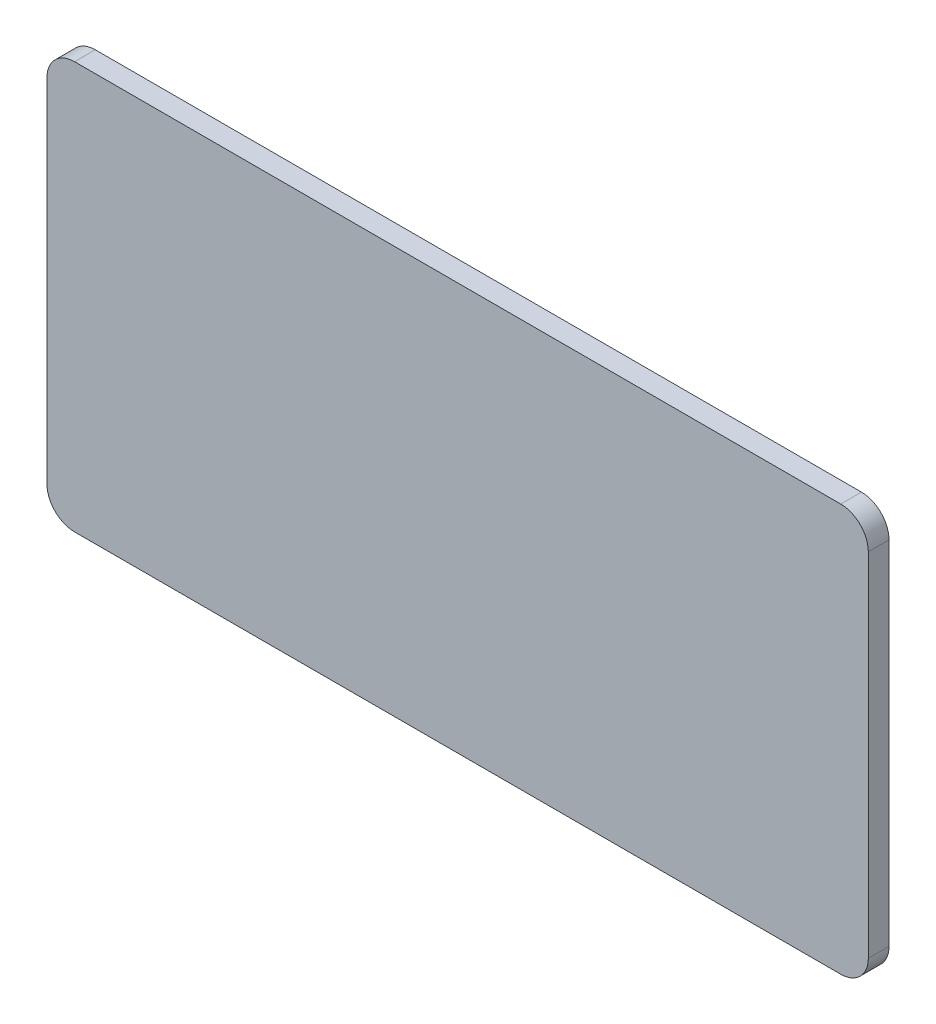
ISO-10303-21;
HEADER;
FILE_DESCRIPTION(('STEP AP214'),'2;1');
FILE_NAME('part.step','',(''),(''),'','','');
FILE_SCHEMA(('AUTOMOTIVE_DESIGN { 1 0 10303 214 1 1 1 1 }'));
ENDSEC;
DATA;
#1=APPLICATION_CONTEXT('core data for automotive mechanical design processes');
#2=APPLICATION_PROTOCOL_DEFINITION('international standard','automotive_design',2000,#1);
#3=PRODUCT_CONTEXT('',#1,'mechanical');
#4=PRODUCT('Part','Part','',(#3));
#5=PRODUCT_RELATED_PRODUCT_CATEGORY('part','',(#4));
#6=PRODUCT_DEFINITION_FORMATION('','',#4);
#7=PRODUCT_DEFINITION_CONTEXT('part definition',#1,'design');
#8=PRODUCT_DEFINITION('design','',#6,#7);
#9=PRODUCT_DEFINITION_SHAPE('','',#8);
#10=(LENGTH_UNIT() NAMED_UNIT(*) SI_UNIT(.MILLI.,.METRE.));
#11=(NAMED_UNIT(*) PLANE_ANGLE_UNIT() SI_UNIT($,.RADIAN.));
#12=(NAMED_UNIT(*) SI_UNIT($,.STERADIAN.) SOLID_ANGLE_UNIT());
#13=UNCERTAINTY_MEASURE_WITH_UNIT(LENGTH_MEASURE(1.E-05),#10,'distance_accuracy_value','');
#14=(GEOMETRIC_REPRESENTATION_CONTEXT(3) GLOBAL_UNCERTAINTY_ASSIGNED_CONTEXT((#13)) GLOBAL_UNIT_ASSIGNED_CONTEXT((#10,
#11,#12)) REPRESENTATION_CONTEXT('',''));
#15=CARTESIAN_POINT('',(0.,0.,0.));
#16=DIRECTION('',(0.,0.,1.));
#17=DIRECTION('',(1.,0.,0.));
#18=AXIS2_PLACEMENT_3D('',#15,#16,#17);
#19=CARTESIAN_POINT('',(29.75,-14.75,1.5));
#20=DIRECTION('',(-1.,0.,0.));
#21=DIRECTION('',(0.,0.,1.));
#22=AXIS2_PLACEMENT_3D('',#19,#20,#21);
#23=PLANE('',#22);
#24=DIRECTION('',(0.,1.,0.));
#25=VECTOR('',#24,1.);
#26=CARTESIAN_POINT('',(29.75,-14.75,1.5));
#27=LINE('',#26,#25);
#28=CARTESIAN_POINT('',(29.75,-12.75,1.5));
#29=VERTEX_POINT('',#28);
#30=CARTESIAN_POINT('',(29.75,12.75,1.5));
#31=VERTEX_POINT('',#30);
#32=EDGE_CURVE('E112',#29,#31,#27,.T.);
#33=ORIENTED_EDGE('',*,*,#32,.F.);
#34=DIRECTION('',(0.,0.,-1.));
#35=VECTOR('',#34,1.);
#36=CARTESIAN_POINT('',(29.75,-12.75,1.5));
#37=LINE('',#36,#35);
#38=CARTESIAN_POINT('',(29.75,-12.75,0.));
#39=VERTEX_POINT('',#38);
#40=EDGE_CURVE('E11',#29,#39,#37,.T.);
#41=ORIENTED_EDGE('',*,*,#40,.T.);
#42=DIRECTION('',(0.,1.,0.));
#43=VECTOR('',#42,1.);
#44=CARTESIAN_POINT('',(29.75,-14.75,0.));
#45=LINE('',#44,#43);
#46=CARTESIAN_POINT('',(29.75,12.75,0.));
#47=VERTEX_POINT('',#46);
#48=EDGE_CURVE('E142',#39,#47,#45,.T.);
#49=ORIENTED_EDGE('',*,*,#48,.T.);
#50=DIRECTION('',(0.,0.,-1.));
#51=VECTOR('',#50,1.);
#52=CARTESIAN_POINT('',(29.75,12.75,1.5));
#53=LINE('',#52,#51);
#54=EDGE_CURVE('E25',#47,#31,#53,.F.);
#55=ORIENTED_EDGE('',*,*,#54,.T.);
#56=EDGE_LOOP('',(#33,#41,#49,#55));
#57=FACE_BOUND('',#56,.T.);
#58=ADVANCED_FACE('F17',(#57),#23,.F.);
#59=CARTESIAN_POINT('',(-29.75,14.75,1.5));
#60=DIRECTION('',(0.,-1.,0.));
#61=DIRECTION('',(0.,0.,-1.));
#62=AXIS2_PLACEMENT_3D('',#59,#60,#61);
#63=PLANE('',#62);
#64=DIRECTION('',(-1.,0.,0.));
#65=VECTOR('',#64,1.);
#66=CARTESIAN_POINT('',(-29.75,14.75,0.));
#67=LINE('',#66,#65);
#68=CARTESIAN_POINT('',(27.75,14.75,0.));
#69=VERTEX_POINT('',#68);
#70=CARTESIAN_POINT('',(-27.75,14.75,0.));
#71=VERTEX_POINT('',#70);
#72=EDGE_CURVE('E116',#69,#71,#67,.T.);
#73=ORIENTED_EDGE('',*,*,#72,.T.);
#74=DIRECTION('',(0.,0.,-1.));
#75=VECTOR('',#74,1.);
#76=CARTESIAN_POINT('',(-27.75,14.75,1.5));
#77=LINE('',#76,#75);
#78=CARTESIAN_POINT('',(-27.75,14.75,1.5));
#79=VERTEX_POINT('',#78);
#80=EDGE_CURVE('E32',#71,#79,#77,.F.);
#81=ORIENTED_EDGE('',*,*,#80,.T.);
#82=DIRECTION('',(-1.,0.,0.));
#83=VECTOR('',#82,1.);
#84=CARTESIAN_POINT('',(-29.75,14.75,1.5));
#85=LINE('',#84,#83);
#86=CARTESIAN_POINT('',(27.75,14.75,1.5));
#87=VERTEX_POINT('',#86);
#88=EDGE_CURVE('E111',#87,#79,#85,.T.);
#89=ORIENTED_EDGE('',*,*,#88,.F.);
#90=DIRECTION('',(0.,0.,-1.));
#91=VECTOR('',#90,1.);
#92=CARTESIAN_POINT('',(27.75,14.75,1.5));
#93=LINE('',#92,#91);
#94=EDGE_CURVE('E133',#87,#69,#93,.T.);
#95=ORIENTED_EDGE('',*,*,#94,.T.);
#96=EDGE_LOOP('',(#73,#81,#89,#95));
#97=FACE_BOUND('',#96,.T.);
#98=ADVANCED_FACE('F149',(#97),#63,.F.);
#99=CARTESIAN_POINT('',(-29.75,-14.75,1.5));
#100=DIRECTION('',(1.,0.,0.));
#101=DIRECTION('',(0.,0.,-1.));
#102=AXIS2_PLACEMENT_3D('',#99,#100,#101);
#103=PLANE('',#102);
#104=DIRECTION('',(0.,-1.,0.));
#105=VECTOR('',#104,1.);
#106=CARTESIAN_POINT('',(-29.75,-14.75,0.));
#107=LINE('',#106,#105);
#108=CARTESIAN_POINT('',(-29.75,12.75,0.));
#109=VERTEX_POINT('',#108);
#110=CARTESIAN_POINT('',(-29.75,-12.75,0.));
#111=VERTEX_POINT('',#110);
#112=EDGE_CURVE('E115',#109,#111,#107,.T.);
#113=ORIENTED_EDGE('',*,*,#112,.T.);
#114=DIRECTION('',(0.,0.,-1.));
#115=VECTOR('',#114,1.);
#116=CARTESIAN_POINT('',(-29.75,-12.75,1.5));
#117=LINE('',#116,#115);
#118=CARTESIAN_POINT('',(-29.75,-12.75,1.5));
#119=VERTEX_POINT('',#118);
#120=EDGE_CURVE('E90',#111,#119,#117,.F.);
#121=ORIENTED_EDGE('',*,*,#120,.T.);
#122=DIRECTION('',(0.,-1.,0.));
#123=VECTOR('',#122,1.);
#124=CARTESIAN_POINT('',(-29.75,-14.75,1.5));
#125=LINE('',#124,#123);
#126=CARTESIAN_POINT('',(-29.75,12.75,1.5));
#127=VERTEX_POINT('',#126);
#128=EDGE_CURVE('E153',#127,#119,#125,.T.);
#129=ORIENTED_EDGE('',*,*,#128,.F.);
#130=DIRECTION('',(0.,0.,-1.));
#131=VECTOR('',#130,1.);
#132=CARTESIAN_POINT('',(-29.75,12.75,1.5));
#133=LINE('',#132,#131);
#134=EDGE_CURVE('E94',#127,#109,#133,.T.);
#135=ORIENTED_EDGE('',*,*,#134,.T.);
#136=EDGE_LOOP('',(#113,#121,#129,#135));
#137=FACE_BOUND('',#136,.T.);
#138=ADVANCED_FACE('F161',(#137),#103,.F.);
#139=CARTESIAN_POINT('',(-29.75,-14.75,1.5));
#140=DIRECTION('',(0.,1.,0.));
#141=DIRECTION('',(0.,0.,1.));
#142=AXIS2_PLACEMENT_3D('',#139,#140,#141);
#143=PLANE('',#142);
#144=DIRECTION('',(1.,0.,0.));
#145=VECTOR('',#144,1.);
#146=CARTESIAN_POINT('',(-29.75,-14.75,1.5));
#147=LINE('',#146,#145);
#148=CARTESIAN_POINT('',(-27.75,-14.75,1.5));
#149=VERTEX_POINT('',#148);
#150=CARTESIAN_POINT('',(27.75,-14.75,1.5));
#151=VERTEX_POINT('',#150);
#152=EDGE_CURVE('E102',#149,#151,#147,.T.);
#153=ORIENTED_EDGE('',*,*,#152,.F.);
#154=DIRECTION('',(0.,0.,-1.));
#155=VECTOR('',#154,1.);
#156=CARTESIAN_POINT('',(-27.75,-14.75,1.5));
#157=LINE('',#156,#155);
#158=CARTESIAN_POINT('',(-27.75,-14.75,0.));
#159=VERTEX_POINT('',#158);
#160=EDGE_CURVE('E86',#149,#159,#157,.T.);
#161=ORIENTED_EDGE('',*,*,#160,.T.);
#162=DIRECTION('',(1.,0.,0.));
#163=VECTOR('',#162,1.);
#164=CARTESIAN_POINT('',(-29.75,-14.75,0.));
#165=LINE('',#164,#163);
#166=CARTESIAN_POINT('',(27.75,-14.75,0.));
#167=VERTEX_POINT('',#166);
#168=EDGE_CURVE('E101',#159,#167,#165,.T.);
#169=ORIENTED_EDGE('',*,*,#168,.T.);
#170=DIRECTION('',(0.,0.,-1.));
#171=VECTOR('',#170,1.);
#172=CARTESIAN_POINT('',(27.75,-14.75,1.5));
#173=LINE('',#172,#171);
#174=EDGE_CURVE('E106',#167,#151,#173,.F.);
#175=ORIENTED_EDGE('',*,*,#174,.T.);
#176=EDGE_LOOP('',(#153,#161,#169,#175));
#177=FACE_BOUND('',#176,.T.);
#178=ADVANCED_FACE('F99',(#177),#143,.F.);
#179=CARTESIAN_POINT('',(0.,0.,1.5));
#180=DIRECTION('',(0.,0.,-1.));
#181=DIRECTION('',(-1.,0.,0.));
#182=AXIS2_PLACEMENT_3D('',#179,#180,#181);
#183=PLANE('',#182);
#184=ORIENTED_EDGE('',*,*,#128,.T.);
#185=CARTESIAN_POINT('',(-27.75,-12.75,1.5));
#186=DIRECTION('',(0.,0.,-1.));
#187=DIRECTION('',(-1.,0.,0.));
#188=AXIS2_PLACEMENT_3D('',#185,#186,#187);
#189=CIRCLE('',#188,2.);
#190=EDGE_CURVE('E135',#119,#149,#189,.F.);
#191=ORIENTED_EDGE('',*,*,#190,.T.);
#192=ORIENTED_EDGE('',*,*,#152,.T.);
#193=CARTESIAN_POINT('',(27.75,-12.75,1.5));
#194=DIRECTION('',(0.,0.,-1.));
#195=DIRECTION('',(-1.,0.,0.));
#196=AXIS2_PLACEMENT_3D('',#193,#194,#195);
#197=CIRCLE('',#196,2.);
#198=EDGE_CURVE('E128',#151,#29,#197,.F.);
#199=ORIENTED_EDGE('',*,*,#198,.T.);
#200=ORIENTED_EDGE('',*,*,#32,.T.);
#201=CARTESIAN_POINT('',(27.75,12.75,1.5));
#202=DIRECTION('',(0.,0.,-1.));
#203=DIRECTION('',(-1.,0.,0.));
#204=AXIS2_PLACEMENT_3D('',#201,#202,#203);
#205=CIRCLE('',#204,2.);
#206=EDGE_CURVE('E39',#31,#87,#205,.F.);
#207=ORIENTED_EDGE('',*,*,#206,.T.);
#208=ORIENTED_EDGE('',*,*,#88,.T.);
#209=CARTESIAN_POINT('',(-27.75,12.75,1.5));
#210=DIRECTION('',(0.,0.,-1.));
#211=DIRECTION('',(-1.,0.,0.));
#212=AXIS2_PLACEMENT_3D('',#209,#210,#211);
#213=CIRCLE('',#212,2.);
#214=EDGE_CURVE('E129',#79,#127,#213,.F.);
#215=ORIENTED_EDGE('',*,*,#214,.T.);
#216=EDGE_LOOP('',(#184,#191,#192,#199,#200,#207,#208,#215));
#217=FACE_BOUND('',#216,.T.);
#218=ADVANCED_FACE('F144',(#217),#183,.F.);
#219=CARTESIAN_POINT('',(0.,0.,0.));
#220=DIRECTION('',(0.,0.,-1.));
#221=DIRECTION('',(-1.,0.,0.));
#222=AXIS2_PLACEMENT_3D('',#219,#220,#221);
#223=PLANE('',#222);
#224=ORIENTED_EDGE('',*,*,#168,.F.);
#225=CARTESIAN_POINT('',(-27.75,-12.75,0.));
#226=DIRECTION('',(0.,0.,-1.));
#227=DIRECTION('',(-1.,0.,0.));
#228=AXIS2_PLACEMENT_3D('',#225,#226,#227);
#229=CIRCLE('',#228,2.);
#230=EDGE_CURVE('E82',#159,#111,#229,.T.);
#231=ORIENTED_EDGE('',*,*,#230,.T.);
#232=ORIENTED_EDGE('',*,*,#112,.F.);
#233=CARTESIAN_POINT('',(-27.75,12.75,0.));
#234=DIRECTION('',(0.,0.,-1.));
#235=DIRECTION('',(-1.,0.,0.));
#236=AXIS2_PLACEMENT_3D('',#233,#234,#235);
#237=CIRCLE('',#236,2.);
#238=EDGE_CURVE('E92',#109,#71,#237,.T.);
#239=ORIENTED_EDGE('',*,*,#238,.T.);
#240=ORIENTED_EDGE('',*,*,#72,.F.);
#241=CARTESIAN_POINT('',(27.75,12.75,0.));
#242=DIRECTION('',(0.,0.,-1.));
#243=DIRECTION('',(-1.,0.,0.));
#244=AXIS2_PLACEMENT_3D('',#241,#242,#243);
#245=CIRCLE('',#244,2.);
#246=EDGE_CURVE('E104',#69,#47,#245,.T.);
#247=ORIENTED_EDGE('',*,*,#246,.T.);
#248=ORIENTED_EDGE('',*,*,#48,.F.);
#249=CARTESIAN_POINT('',(27.75,-12.75,0.));
#250=DIRECTION('',(0.,0.,-1.));
#251=DIRECTION('',(-1.,0.,0.));
#252=AXIS2_PLACEMENT_3D('',#249,#250,#251);
#253=CIRCLE('',#252,2.);
#254=EDGE_CURVE('E109',#39,#167,#253,.T.);
#255=ORIENTED_EDGE('',*,*,#254,.T.);
#256=EDGE_LOOP('',(#224,#231,#232,#239,#240,#247,#248,#255));
#257=FACE_BOUND('',#256,.T.);
#258=ADVANCED_FACE('F107',(#257),#223,.T.);
#259=CARTESIAN_POINT('',(-27.75,-12.75,1.5));
#260=DIRECTION('',(0.,0.,-1.));
#261=DIRECTION('',(-1.,0.,0.));
#262=AXIS2_PLACEMENT_3D('',#259,#260,#261);
#263=CYLINDRICAL_SURFACE('',#262,2.);
#264=ORIENTED_EDGE('',*,*,#190,.F.);
#265=ORIENTED_EDGE('',*,*,#120,.F.);
#266=ORIENTED_EDGE('',*,*,#230,.F.);
#267=ORIENTED_EDGE('',*,*,#160,.F.);
#268=EDGE_LOOP('',(#264,#265,#266,#267));
#269=FACE_BOUND('',#268,.T.);
#270=ADVANCED_FACE('F87',(#269),#263,.T.);
#271=CARTESIAN_POINT('',(-27.75,12.75,1.5));
#272=DIRECTION('',(0.,0.,-1.));
#273=DIRECTION('',(-1.,0.,0.));
#274=AXIS2_PLACEMENT_3D('',#271,#272,#273);
#275=CYLINDRICAL_SURFACE('',#274,2.);
#276=ORIENTED_EDGE('',*,*,#214,.F.);
#277=ORIENTED_EDGE('',*,*,#80,.F.);
#278=ORIENTED_EDGE('',*,*,#238,.F.);
#279=ORIENTED_EDGE('',*,*,#134,.F.);
#280=EDGE_LOOP('',(#276,#277,#278,#279));
#281=FACE_BOUND('',#280,.T.);
#282=ADVANCED_FACE('F157',(#281),#275,.T.);
#283=CARTESIAN_POINT('',(27.75,-12.75,1.5));
#284=DIRECTION('',(0.,0.,-1.));
#285=DIRECTION('',(-1.,0.,0.));
#286=AXIS2_PLACEMENT_3D('',#283,#284,#285);
#287=CYLINDRICAL_SURFACE('',#286,2.);
#288=ORIENTED_EDGE('',*,*,#198,.F.);
#289=ORIENTED_EDGE('',*,*,#174,.F.);
#290=ORIENTED_EDGE('',*,*,#254,.F.);
#291=ORIENTED_EDGE('',*,*,#40,.F.);
#292=EDGE_LOOP('',(#288,#289,#290,#291));
#293=FACE_BOUND('',#292,.T.);
#294=ADVANCED_FACE('F162',(#293),#287,.T.);
#295=CARTESIAN_POINT('',(27.75,12.75,1.5));
#296=DIRECTION('',(0.,0.,-1.));
#297=DIRECTION('',(-1.,0.,0.));
#298=AXIS2_PLACEMENT_3D('',#295,#296,#297);
#299=CYLINDRICAL_SURFACE('',#298,2.);
#300=ORIENTED_EDGE('',*,*,#206,.F.);
#301=ORIENTED_EDGE('',*,*,#54,.F.);
#302=ORIENTED_EDGE('',*,*,#246,.F.);
#303=ORIENTED_EDGE('',*,*,#94,.F.);
#304=EDGE_LOOP('',(#300,#301,#302,#303));
#305=FACE_BOUND('',#304,.T.);
#306=ADVANCED_FACE('F19',(#305),#299,.T.);
#307=CLOSED_SHELL('',(#58,#98,#138,#178,#218,#258,#270,#282,#294,#306));
#308=MANIFOLD_SOLID_BREP('B1',#307);
#309=ADVANCED_BREP_SHAPE_REPRESENTATION('',(#18,#308),#14);
#310=SHAPE_DEFINITION_REPRESENTATION(#9,#309);
ENDSEC;
END-ISO-10303-21;
